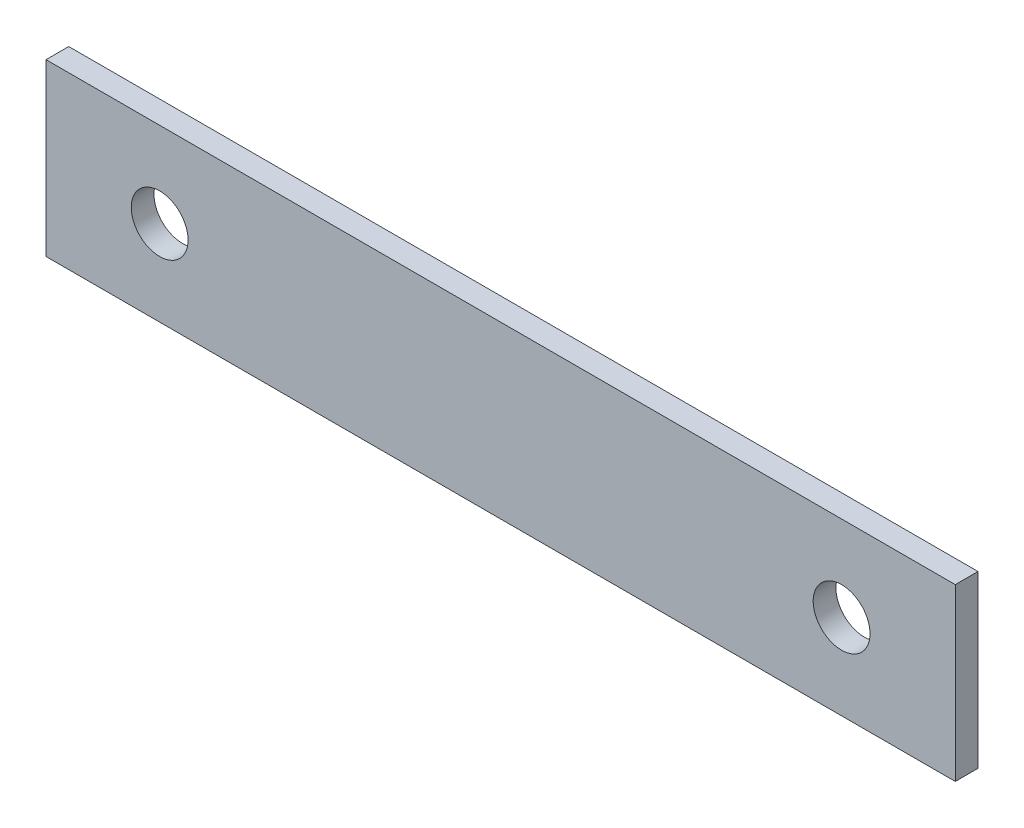
ISO-10303-21;
HEADER;
FILE_DESCRIPTION(('STEP AP214'),'2;1');
FILE_NAME('part.step','',(''),(''),'','','');
FILE_SCHEMA(('AUTOMOTIVE_DESIGN { 1 0 10303 214 1 1 1 1 }'));
ENDSEC;
DATA;
#1=APPLICATION_CONTEXT('core data for automotive mechanical design processes');
#2=APPLICATION_PROTOCOL_DEFINITION('international standard','automotive_design',2000,#1);
#3=PRODUCT_CONTEXT('',#1,'mechanical');
#4=PRODUCT('Part','Part','',(#3));
#5=PRODUCT_RELATED_PRODUCT_CATEGORY('part','',(#4));
#6=PRODUCT_DEFINITION_FORMATION('','',#4);
#7=PRODUCT_DEFINITION_CONTEXT('part definition',#1,'design');
#8=PRODUCT_DEFINITION('design','',#6,#7);
#9=PRODUCT_DEFINITION_SHAPE('','',#8);
#10=(LENGTH_UNIT() NAMED_UNIT(*) SI_UNIT(.MILLI.,.METRE.));
#11=(NAMED_UNIT(*) PLANE_ANGLE_UNIT() SI_UNIT($,.RADIAN.));
#12=(NAMED_UNIT(*) SI_UNIT($,.STERADIAN.) SOLID_ANGLE_UNIT());
#13=UNCERTAINTY_MEASURE_WITH_UNIT(LENGTH_MEASURE(1.E-05),#10,'distance_accuracy_value','');
#14=(GEOMETRIC_REPRESENTATION_CONTEXT(3) GLOBAL_UNCERTAINTY_ASSIGNED_CONTEXT((#13)) GLOBAL_UNIT_ASSIGNED_CONTEXT((#10,
#11,#12)) REPRESENTATION_CONTEXT('',''));
#15=CARTESIAN_POINT('',(0.,0.,0.));
#16=DIRECTION('',(0.,0.,1.));
#17=DIRECTION('',(1.,0.,0.));
#18=AXIS2_PLACEMENT_3D('',#15,#16,#17);
#19=CARTESIAN_POINT('',(0.,0.,-2.));
#20=DIRECTION('',(-1.,0.,0.));
#21=DIRECTION('',(0.,0.,1.));
#22=AXIS2_PLACEMENT_3D('',#19,#20,#21);
#23=PLANE('',#22);
#24=DIRECTION('',(0.,-1.,0.));
#25=VECTOR('',#24,1.);
#26=CARTESIAN_POINT('',(0.,0.,0.));
#27=LINE('',#26,#25);
#28=CARTESIAN_POINT('',(0.,15.,0.));
#29=VERTEX_POINT('',#28);
#30=CARTESIAN_POINT('',(0.,0.,0.));
#31=VERTEX_POINT('',#30);
#32=EDGE_CURVE('E104',#29,#31,#27,.T.);
#33=ORIENTED_EDGE('',*,*,#32,.F.);
#34=DIRECTION('',(0.,0.,1.));
#35=VECTOR('',#34,1.);
#36=CARTESIAN_POINT('',(0.,15.,-2.));
#37=LINE('',#36,#35);
#38=CARTESIAN_POINT('',(0.,15.,-2.));
#39=VERTEX_POINT('',#38);
#40=EDGE_CURVE('E11',#39,#29,#37,.T.);
#41=ORIENTED_EDGE('',*,*,#40,.F.);
#42=DIRECTION('',(0.,-1.,0.));
#43=VECTOR('',#42,1.);
#44=CARTESIAN_POINT('',(0.,0.,-2.));
#45=LINE('',#44,#43);
#46=CARTESIAN_POINT('',(0.,0.,-2.));
#47=VERTEX_POINT('',#46);
#48=EDGE_CURVE('E97',#39,#47,#45,.T.);
#49=ORIENTED_EDGE('',*,*,#48,.T.);
#50=DIRECTION('',(0.,0.,1.));
#51=VECTOR('',#50,1.);
#52=CARTESIAN_POINT('',(0.,0.,-2.));
#53=LINE('',#52,#51);
#54=EDGE_CURVE('E42',#47,#31,#53,.T.);
#55=ORIENTED_EDGE('',*,*,#54,.T.);
#56=EDGE_LOOP('',(#33,#41,#49,#55));
#57=FACE_BOUND('',#56,.T.);
#58=ADVANCED_FACE('F39',(#57),#23,.T.);
#59=CARTESIAN_POINT('',(0.,15.,-2.));
#60=DIRECTION('',(0.,1.,0.));
#61=DIRECTION('',(0.,0.,1.));
#62=AXIS2_PLACEMENT_3D('',#59,#60,#61);
#63=PLANE('',#62);
#64=DIRECTION('',(-1.,0.,0.));
#65=VECTOR('',#64,1.);
#66=CARTESIAN_POINT('',(0.,15.,0.));
#67=LINE('',#66,#65);
#68=CARTESIAN_POINT('',(80.,15.,0.));
#69=VERTEX_POINT('',#68);
#70=EDGE_CURVE('E99',#69,#29,#67,.T.);
#71=ORIENTED_EDGE('',*,*,#70,.F.);
#72=DIRECTION('',(0.,0.,1.));
#73=VECTOR('',#72,1.);
#74=CARTESIAN_POINT('',(80.,15.,-2.));
#75=LINE('',#74,#73);
#76=CARTESIAN_POINT('',(80.,15.,-2.));
#77=VERTEX_POINT('',#76);
#78=EDGE_CURVE('E48',#77,#69,#75,.T.);
#79=ORIENTED_EDGE('',*,*,#78,.F.);
#80=DIRECTION('',(-1.,0.,0.));
#81=VECTOR('',#80,1.);
#82=CARTESIAN_POINT('',(0.,15.,-2.));
#83=LINE('',#82,#81);
#84=EDGE_CURVE('E94',#77,#39,#83,.T.);
#85=ORIENTED_EDGE('',*,*,#84,.T.);
#86=ORIENTED_EDGE('',*,*,#40,.T.);
#87=EDGE_LOOP('',(#71,#79,#85,#86));
#88=FACE_BOUND('',#87,.T.);
#89=ADVANCED_FACE('F115',(#88),#63,.T.);
#90=CARTESIAN_POINT('',(80.,0.,-2.));
#91=DIRECTION('',(1.,0.,0.));
#92=DIRECTION('',(0.,0.,-1.));
#93=AXIS2_PLACEMENT_3D('',#90,#91,#92);
#94=PLANE('',#93);
#95=DIRECTION('',(0.,1.,0.));
#96=VECTOR('',#95,1.);
#97=CARTESIAN_POINT('',(80.,0.,0.));
#98=LINE('',#97,#96);
#99=CARTESIAN_POINT('',(80.,0.,0.));
#100=VERTEX_POINT('',#99);
#101=EDGE_CURVE('E89',#100,#69,#98,.T.);
#102=ORIENTED_EDGE('',*,*,#101,.F.);
#103=DIRECTION('',(0.,0.,1.));
#104=VECTOR('',#103,1.);
#105=CARTESIAN_POINT('',(80.,0.,-2.));
#106=LINE('',#105,#104);
#107=CARTESIAN_POINT('',(80.,0.,-2.));
#108=VERTEX_POINT('',#107);
#109=EDGE_CURVE('E84',#108,#100,#106,.T.);
#110=ORIENTED_EDGE('',*,*,#109,.F.);
#111=DIRECTION('',(0.,1.,0.));
#112=VECTOR('',#111,1.);
#113=CARTESIAN_POINT('',(80.,0.,-2.));
#114=LINE('',#113,#112);
#115=EDGE_CURVE('E87',#108,#77,#114,.T.);
#116=ORIENTED_EDGE('',*,*,#115,.T.);
#117=ORIENTED_EDGE('',*,*,#78,.T.);
#118=EDGE_LOOP('',(#102,#110,#116,#117));
#119=FACE_BOUND('',#118,.T.);
#120=ADVANCED_FACE('F86',(#119),#94,.T.);
#121=CARTESIAN_POINT('',(0.,0.,-2.));
#122=DIRECTION('',(0.,-1.,0.));
#123=DIRECTION('',(0.,0.,-1.));
#124=AXIS2_PLACEMENT_3D('',#121,#122,#123);
#125=PLANE('',#124);
#126=DIRECTION('',(1.,0.,0.));
#127=VECTOR('',#126,1.);
#128=CARTESIAN_POINT('',(0.,0.,0.));
#129=LINE('',#128,#127);
#130=EDGE_CURVE('E107',#31,#100,#129,.T.);
#131=ORIENTED_EDGE('',*,*,#130,.F.);
#132=ORIENTED_EDGE('',*,*,#54,.F.);
#133=DIRECTION('',(1.,0.,0.));
#134=VECTOR('',#133,1.);
#135=CARTESIAN_POINT('',(0.,0.,-2.));
#136=LINE('',#135,#134);
#137=EDGE_CURVE('E93',#47,#108,#136,.T.);
#138=ORIENTED_EDGE('',*,*,#137,.T.);
#139=ORIENTED_EDGE('',*,*,#109,.T.);
#140=EDGE_LOOP('',(#131,#132,#138,#139));
#141=FACE_BOUND('',#140,.T.);
#142=ADVANCED_FACE('F96',(#141),#125,.T.);
#143=CARTESIAN_POINT('',(0.,0.,-2.));
#144=DIRECTION('',(0.,0.,-1.));
#145=DIRECTION('',(-1.,0.,0.));
#146=AXIS2_PLACEMENT_3D('',#143,#144,#145);
#147=PLANE('',#146);
#148=CARTESIAN_POINT('',(70.,7.5,-2.));
#149=DIRECTION('',(0.,0.,-1.));
#150=DIRECTION('',(-1.,0.,0.));
#151=AXIS2_PLACEMENT_3D('',#148,#149,#150);
#152=CIRCLE('',#151,2.49999999999999);
#153=CARTESIAN_POINT('',(67.5,7.5,-2.));
#154=VERTEX_POINT('',#153);
#155=EDGE_CURVE('E148',#154,#154,#152,.F.);
#156=ORIENTED_EDGE('',*,*,#155,.T.);
#157=EDGE_LOOP('',(#156));
#158=FACE_BOUND('',#157,.T.);
#159=CARTESIAN_POINT('',(10.,7.5,-2.));
#160=DIRECTION('',(0.,0.,-1.));
#161=DIRECTION('',(-1.,0.,0.));
#162=AXIS2_PLACEMENT_3D('',#159,#160,#161);
#163=CIRCLE('',#162,2.5);
#164=CARTESIAN_POINT('',(7.5,7.5,-2.));
#165=VERTEX_POINT('',#164);
#166=EDGE_CURVE('E152',#165,#165,#163,.F.);
#167=ORIENTED_EDGE('',*,*,#166,.T.);
#168=EDGE_LOOP('',(#167));
#169=FACE_BOUND('',#168,.T.);
#170=ORIENTED_EDGE('',*,*,#48,.F.);
#171=ORIENTED_EDGE('',*,*,#84,.F.);
#172=ORIENTED_EDGE('',*,*,#115,.F.);
#173=ORIENTED_EDGE('',*,*,#137,.F.);
#174=EDGE_LOOP('',(#170,#171,#172,#173));
#175=FACE_BOUND('',#174,.T.);
#176=ADVANCED_FACE('F92',(#158,#169,#175),#147,.T.);
#177=CARTESIAN_POINT('',(0.,0.,0.));
#178=DIRECTION('',(0.,0.,-1.));
#179=DIRECTION('',(-1.,0.,0.));
#180=AXIS2_PLACEMENT_3D('',#177,#178,#179);
#181=PLANE('',#180);
#182=CARTESIAN_POINT('',(70.,7.5,0.));
#183=DIRECTION('',(0.,0.,1.));
#184=DIRECTION('',(1.,0.,0.));
#185=AXIS2_PLACEMENT_3D('',#182,#183,#184);
#186=CIRCLE('',#185,2.49999999999999);
#187=CARTESIAN_POINT('',(72.5,7.5,0.));
#188=VERTEX_POINT('',#187);
#189=EDGE_CURVE('E151',#188,#188,#186,.T.);
#190=ORIENTED_EDGE('',*,*,#189,.F.);
#191=EDGE_LOOP('',(#190));
#192=FACE_BOUND('',#191,.T.);
#193=CARTESIAN_POINT('',(10.,7.5,0.));
#194=DIRECTION('',(0.,0.,1.));
#195=DIRECTION('',(1.,0.,0.));
#196=AXIS2_PLACEMENT_3D('',#193,#194,#195);
#197=CIRCLE('',#196,2.5);
#198=CARTESIAN_POINT('',(12.5,7.5,0.));
#199=VERTEX_POINT('',#198);
#200=EDGE_CURVE('E108',#199,#199,#197,.T.);
#201=ORIENTED_EDGE('',*,*,#200,.F.);
#202=EDGE_LOOP('',(#201));
#203=FACE_BOUND('',#202,.T.);
#204=ORIENTED_EDGE('',*,*,#32,.T.);
#205=ORIENTED_EDGE('',*,*,#130,.T.);
#206=ORIENTED_EDGE('',*,*,#101,.T.);
#207=ORIENTED_EDGE('',*,*,#70,.T.);
#208=EDGE_LOOP('',(#204,#205,#206,#207));
#209=FACE_BOUND('',#208,.T.);
#210=ADVANCED_FACE('F114',(#192,#203,#209),#181,.F.);
#211=CARTESIAN_POINT('',(10.,7.5,-2.001));
#212=DIRECTION('',(0.,0.,1.));
#213=DIRECTION('',(1.,0.,0.));
#214=AXIS2_PLACEMENT_3D('',#211,#212,#213);
#215=CYLINDRICAL_SURFACE('',#214,2.5);
#216=ORIENTED_EDGE('',*,*,#166,.F.);
#217=EDGE_LOOP('',(#216));
#218=FACE_BOUND('',#217,.T.);
#219=ORIENTED_EDGE('',*,*,#200,.T.);
#220=EDGE_LOOP('',(#219));
#221=FACE_BOUND('',#220,.T.);
#222=ADVANCED_FACE('F133',(#218,#221),#215,.F.);
#223=CARTESIAN_POINT('',(70.,7.5,-2.001));
#224=DIRECTION('',(0.,0.,1.));
#225=DIRECTION('',(1.,0.,0.));
#226=AXIS2_PLACEMENT_3D('',#223,#224,#225);
#227=CYLINDRICAL_SURFACE('',#226,2.49999999999999);
#228=ORIENTED_EDGE('',*,*,#155,.F.);
#229=EDGE_LOOP('',(#228));
#230=FACE_BOUND('',#229,.T.);
#231=ORIENTED_EDGE('',*,*,#189,.T.);
#232=EDGE_LOOP('',(#231));
#233=FACE_BOUND('',#232,.T.);
#234=ADVANCED_FACE('F140',(#230,#233),#227,.F.);
#235=CLOSED_SHELL('',(#58,#89,#120,#142,#176,#210,#222,#234));
#236=MANIFOLD_SOLID_BREP('B2',#235);
#237=ADVANCED_BREP_SHAPE_REPRESENTATION('',(#18,#236),#14);
#238=SHAPE_DEFINITION_REPRESENTATION(#9,#237);
ENDSEC;
END-ISO-10303-21;
